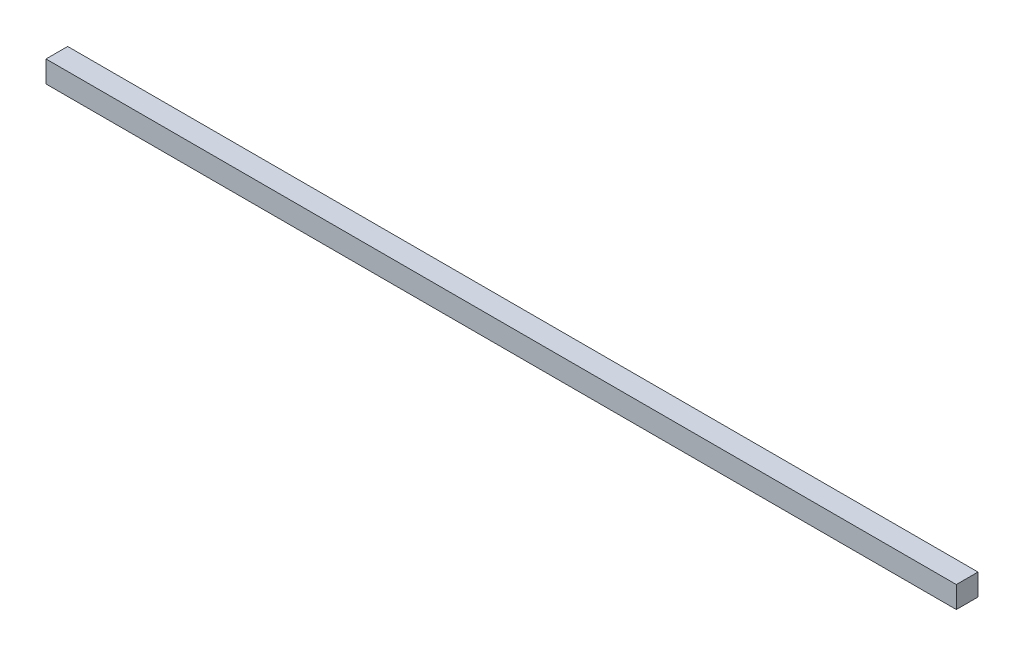
ISO-10303-21;
HEADER;
FILE_DESCRIPTION(('STEP AP214'),'2;1');
FILE_NAME('part.step','',(''),(''),'','','');
FILE_SCHEMA(('AUTOMOTIVE_DESIGN { 1 0 10303 214 1 1 1 1 }'));
ENDSEC;
DATA;
#1=APPLICATION_CONTEXT('core data for automotive mechanical design processes');
#2=APPLICATION_PROTOCOL_DEFINITION('international standard','automotive_design',2000,#1);
#3=PRODUCT_CONTEXT('',#1,'mechanical');
#4=PRODUCT('Part','Part','',(#3));
#5=PRODUCT_RELATED_PRODUCT_CATEGORY('part','',(#4));
#6=PRODUCT_DEFINITION_FORMATION('','',#4);
#7=PRODUCT_DEFINITION_CONTEXT('part definition',#1,'design');
#8=PRODUCT_DEFINITION('design','',#6,#7);
#9=PRODUCT_DEFINITION_SHAPE('','',#8);
#10=(LENGTH_UNIT() NAMED_UNIT(*) SI_UNIT(.MILLI.,.METRE.));
#11=(NAMED_UNIT(*) PLANE_ANGLE_UNIT() SI_UNIT($,.RADIAN.));
#12=(NAMED_UNIT(*) SI_UNIT($,.STERADIAN.) SOLID_ANGLE_UNIT());
#13=UNCERTAINTY_MEASURE_WITH_UNIT(LENGTH_MEASURE(1.E-05),#10,'distance_accuracy_value','');
#14=(GEOMETRIC_REPRESENTATION_CONTEXT(3) GLOBAL_UNCERTAINTY_ASSIGNED_CONTEXT((#13)) GLOBAL_UNIT_ASSIGNED_CONTEXT((#10,
#11,#12)) REPRESENTATION_CONTEXT('',''));
#15=CARTESIAN_POINT('',(0.,0.,0.));
#16=DIRECTION('',(0.,0.,1.));
#17=DIRECTION('',(1.,0.,0.));
#18=AXIS2_PLACEMENT_3D('',#15,#16,#17);
#19=CARTESIAN_POINT('',(0.,6.35,0.));
#20=DIRECTION('',(1.,0.,0.));
#21=DIRECTION('',(0.,0.,-1.));
#22=AXIS2_PLACEMENT_3D('',#19,#20,#21);
#23=PLANE('',#22);
#24=DIRECTION('',(0.,0.,1.));
#25=VECTOR('',#24,1.);
#26=CARTESIAN_POINT('',(0.,0.,0.));
#27=LINE('',#26,#25);
#28=CARTESIAN_POINT('',(0.,0.,-6.35));
#29=VERTEX_POINT('',#28);
#30=CARTESIAN_POINT('',(0.,0.,0.));
#31=VERTEX_POINT('',#30);
#32=EDGE_CURVE('E105',#29,#31,#27,.T.);
#33=ORIENTED_EDGE('',*,*,#32,.T.);
#34=DIRECTION('',(0.,-1.,0.));
#35=VECTOR('',#34,1.);
#36=CARTESIAN_POINT('',(0.,6.35,0.));
#37=LINE('',#36,#35);
#38=CARTESIAN_POINT('',(0.,6.35,0.));
#39=VERTEX_POINT('',#38);
#40=EDGE_CURVE('E11',#39,#31,#37,.T.);
#41=ORIENTED_EDGE('',*,*,#40,.F.);
#42=DIRECTION('',(0.,0.,1.));
#43=VECTOR('',#42,1.);
#44=CARTESIAN_POINT('',(0.,6.35,0.));
#45=LINE('',#44,#43);
#46=CARTESIAN_POINT('',(0.,6.35,-6.35));
#47=VERTEX_POINT('',#46);
#48=EDGE_CURVE('E89',#47,#39,#45,.T.);
#49=ORIENTED_EDGE('',*,*,#48,.F.);
#50=DIRECTION('',(0.,-1.,0.));
#51=VECTOR('',#50,1.);
#52=CARTESIAN_POINT('',(0.,6.35,-6.35));
#53=LINE('',#52,#51);
#54=EDGE_CURVE('E97',#47,#29,#53,.T.);
#55=ORIENTED_EDGE('',*,*,#54,.T.);
#56=EDGE_LOOP('',(#33,#41,#49,#55));
#57=FACE_BOUND('',#56,.T.);
#58=ADVANCED_FACE('F39',(#57),#23,.F.);
#59=CARTESIAN_POINT('',(0.,6.35,0.));
#60=DIRECTION('',(0.,0.,-1.));
#61=DIRECTION('',(-1.,0.,0.));
#62=AXIS2_PLACEMENT_3D('',#59,#60,#61);
#63=PLANE('',#62);
#64=DIRECTION('',(1.,0.,0.));
#65=VECTOR('',#64,1.);
#66=CARTESIAN_POINT('',(0.,0.,0.));
#67=LINE('',#66,#65);
#68=CARTESIAN_POINT('',(266.7,0.,0.));
#69=VERTEX_POINT('',#68);
#70=EDGE_CURVE('E92',#31,#69,#67,.T.);
#71=ORIENTED_EDGE('',*,*,#70,.T.);
#72=DIRECTION('',(0.,-1.,0.));
#73=VECTOR('',#72,1.);
#74=CARTESIAN_POINT('',(266.7,6.35,0.));
#75=LINE('',#74,#73);
#76=CARTESIAN_POINT('',(266.7,6.35,0.));
#77=VERTEX_POINT('',#76);
#78=EDGE_CURVE('E50',#77,#69,#75,.T.);
#79=ORIENTED_EDGE('',*,*,#78,.F.);
#80=DIRECTION('',(1.,0.,0.));
#81=VECTOR('',#80,1.);
#82=CARTESIAN_POINT('',(0.,6.35,0.));
#83=LINE('',#82,#81);
#84=EDGE_CURVE('E82',#39,#77,#83,.T.);
#85=ORIENTED_EDGE('',*,*,#84,.F.);
#86=ORIENTED_EDGE('',*,*,#40,.T.);
#87=EDGE_LOOP('',(#71,#79,#85,#86));
#88=FACE_BOUND('',#87,.T.);
#89=ADVANCED_FACE('F93',(#88),#63,.F.);
#90=CARTESIAN_POINT('',(266.7,6.35,0.));
#91=DIRECTION('',(-1.,0.,0.));
#92=DIRECTION('',(0.,0.,1.));
#93=AXIS2_PLACEMENT_3D('',#90,#91,#92);
#94=PLANE('',#93);
#95=DIRECTION('',(0.,0.,-1.));
#96=VECTOR('',#95,1.);
#97=CARTESIAN_POINT('',(266.7,0.,0.));
#98=LINE('',#97,#96);
#99=CARTESIAN_POINT('',(266.7,0.,-6.35));
#100=VERTEX_POINT('',#99);
#101=EDGE_CURVE('E74',#69,#100,#98,.T.);
#102=ORIENTED_EDGE('',*,*,#101,.T.);
#103=DIRECTION('',(0.,-1.,0.));
#104=VECTOR('',#103,1.);
#105=CARTESIAN_POINT('',(266.7,6.35,-6.35));
#106=LINE('',#105,#104);
#107=CARTESIAN_POINT('',(266.7,6.35,-6.35));
#108=VERTEX_POINT('',#107);
#109=EDGE_CURVE('E94',#108,#100,#106,.T.);
#110=ORIENTED_EDGE('',*,*,#109,.F.);
#111=DIRECTION('',(0.,0.,-1.));
#112=VECTOR('',#111,1.);
#113=CARTESIAN_POINT('',(266.7,6.35,0.));
#114=LINE('',#113,#112);
#115=EDGE_CURVE('E88',#77,#108,#114,.T.);
#116=ORIENTED_EDGE('',*,*,#115,.F.);
#117=ORIENTED_EDGE('',*,*,#78,.T.);
#118=EDGE_LOOP('',(#102,#110,#116,#117));
#119=FACE_BOUND('',#118,.T.);
#120=ADVANCED_FACE('F96',(#119),#94,.F.);
#121=CARTESIAN_POINT('',(0.,6.35,-6.35));
#122=DIRECTION('',(0.,0.,1.));
#123=DIRECTION('',(1.,0.,0.));
#124=AXIS2_PLACEMENT_3D('',#121,#122,#123);
#125=PLANE('',#124);
#126=DIRECTION('',(-1.,0.,0.));
#127=VECTOR('',#126,1.);
#128=CARTESIAN_POINT('',(0.,0.,-6.35));
#129=LINE('',#128,#127);
#130=EDGE_CURVE('E76',#100,#29,#129,.T.);
#131=ORIENTED_EDGE('',*,*,#130,.T.);
#132=ORIENTED_EDGE('',*,*,#54,.F.);
#133=DIRECTION('',(-1.,0.,0.));
#134=VECTOR('',#133,1.);
#135=CARTESIAN_POINT('',(0.,6.35,-6.35));
#136=LINE('',#135,#134);
#137=EDGE_CURVE('E54',#108,#47,#136,.T.);
#138=ORIENTED_EDGE('',*,*,#137,.F.);
#139=ORIENTED_EDGE('',*,*,#109,.T.);
#140=EDGE_LOOP('',(#131,#132,#138,#139));
#141=FACE_BOUND('',#140,.T.);
#142=ADVANCED_FACE('F106',(#141),#125,.F.);
#143=CARTESIAN_POINT('',(0.,6.35,0.));
#144=DIRECTION('',(0.,-1.,0.));
#145=DIRECTION('',(0.,0.,-1.));
#146=AXIS2_PLACEMENT_3D('',#143,#144,#145);
#147=PLANE('',#146);
#148=ORIENTED_EDGE('',*,*,#48,.T.);
#149=ORIENTED_EDGE('',*,*,#84,.T.);
#150=ORIENTED_EDGE('',*,*,#115,.T.);
#151=ORIENTED_EDGE('',*,*,#137,.T.);
#152=EDGE_LOOP('',(#148,#149,#150,#151));
#153=FACE_BOUND('',#152,.T.);
#154=ADVANCED_FACE('F86',(#153),#147,.F.);
#155=CARTESIAN_POINT('',(0.,0.,0.));
#156=DIRECTION('',(0.,-1.,0.));
#157=DIRECTION('',(0.,0.,-1.));
#158=AXIS2_PLACEMENT_3D('',#155,#156,#157);
#159=PLANE('',#158);
#160=ORIENTED_EDGE('',*,*,#32,.F.);
#161=ORIENTED_EDGE('',*,*,#130,.F.);
#162=ORIENTED_EDGE('',*,*,#101,.F.);
#163=ORIENTED_EDGE('',*,*,#70,.F.);
#164=EDGE_LOOP('',(#160,#161,#162,#163));
#165=FACE_BOUND('',#164,.T.);
#166=ADVANCED_FACE('F115',(#165),#159,.T.);
#167=CLOSED_SHELL('',(#58,#89,#120,#142,#154,#166));
#168=MANIFOLD_SOLID_BREP('B2',#167);
#169=ADVANCED_BREP_SHAPE_REPRESENTATION('',(#18,#168),#14);
#170=SHAPE_DEFINITION_REPRESENTATION(#9,#169);
ENDSEC;
END-ISO-10303-21;
